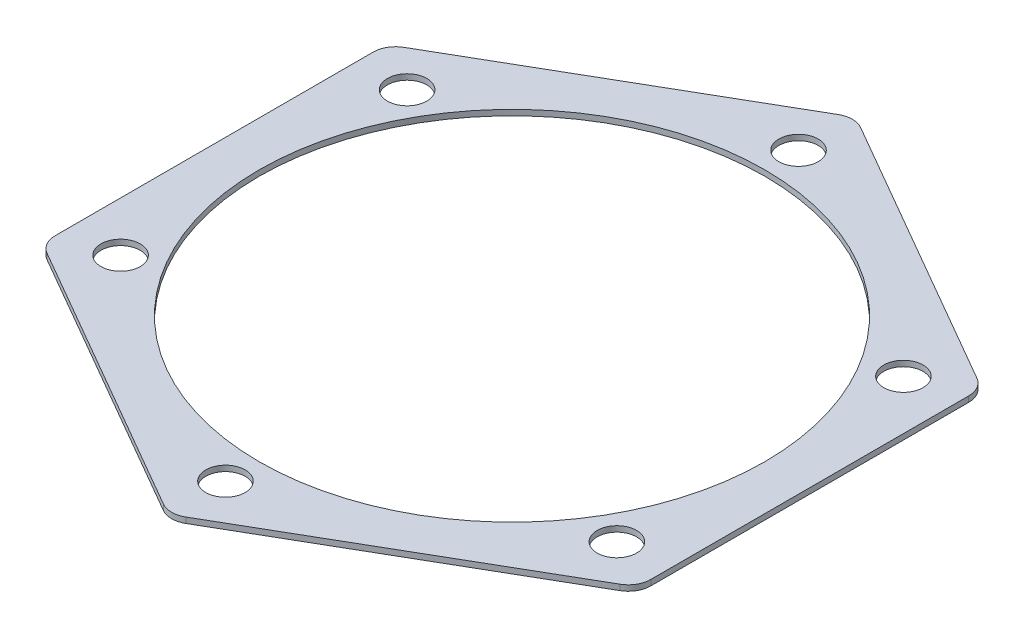
ISO-10303-21;
HEADER;
FILE_DESCRIPTION(('STEP AP214'),'2;1');
FILE_NAME('part.step','',(''),(''),'','','');
FILE_SCHEMA(('AUTOMOTIVE_DESIGN { 1 0 10303 214 1 1 1 1 }'));
ENDSEC;
DATA;
#1=APPLICATION_CONTEXT('core data for automotive mechanical design processes');
#2=APPLICATION_PROTOCOL_DEFINITION('international standard','automotive_design',2000,#1);
#3=PRODUCT_CONTEXT('',#1,'mechanical');
#4=PRODUCT('Part','Part','',(#3));
#5=PRODUCT_RELATED_PRODUCT_CATEGORY('part','',(#4));
#6=PRODUCT_DEFINITION_FORMATION('','',#4);
#7=PRODUCT_DEFINITION_CONTEXT('part definition',#1,'design');
#8=PRODUCT_DEFINITION('design','',#6,#7);
#9=PRODUCT_DEFINITION_SHAPE('','',#8);
#10=(LENGTH_UNIT() NAMED_UNIT(*) SI_UNIT(.MILLI.,.METRE.));
#11=(NAMED_UNIT(*) PLANE_ANGLE_UNIT() SI_UNIT($,.RADIAN.));
#12=(NAMED_UNIT(*) SI_UNIT($,.STERADIAN.) SOLID_ANGLE_UNIT());
#13=UNCERTAINTY_MEASURE_WITH_UNIT(LENGTH_MEASURE(1.E-05),#10,'distance_accuracy_value','');
#14=(GEOMETRIC_REPRESENTATION_CONTEXT(3) GLOBAL_UNCERTAINTY_ASSIGNED_CONTEXT((#13)) GLOBAL_UNIT_ASSIGNED_CONTEXT((#10,
#11,#12)) REPRESENTATION_CONTEXT('',''));
#15=CARTESIAN_POINT('',(0.,0.,0.));
#16=DIRECTION('',(0.,0.,1.));
#17=DIRECTION('',(1.,0.,0.));
#18=AXIS2_PLACEMENT_3D('',#15,#16,#17);
#19=CARTESIAN_POINT('',(-49.,1.,-28.2901631902917));
#20=DIRECTION('',(0.,-1.,0.));
#21=DIRECTION('',(0.,0.,-1.));
#22=AXIS2_PLACEMENT_3D('',#19,#20,#21);
#23=CYLINDRICAL_SURFACE('',#22,4.);
#24=CARTESIAN_POINT('',(-49.,0.,-28.2901631902917));
#25=DIRECTION('',(0.,1.,0.));
#26=DIRECTION('',(0.,0.,-1.));
#27=AXIS2_PLACEMENT_3D('',#24,#25,#26);
#28=CIRCLE('',#27,4.);
#29=CARTESIAN_POINT('',(-51.,0.,-31.7542648054294));
#30=VERTEX_POINT('',#29);
#31=CARTESIAN_POINT('',(-53.,0.,-28.2901631902917));
#32=VERTEX_POINT('',#31);
#33=EDGE_CURVE('E168',#30,#32,#28,.T.);
#34=ORIENTED_EDGE('',*,*,#33,.T.);
#35=DIRECTION('',(0.,-1.,0.));
#36=VECTOR('',#35,1.);
#37=CARTESIAN_POINT('',(-53.,1.,-28.2901631902917));
#38=LINE('',#37,#36);
#39=CARTESIAN_POINT('',(-53.,1.,-28.2901631902917));
#40=VERTEX_POINT('',#39);
#41=EDGE_CURVE('E11',#40,#32,#38,.T.);
#42=ORIENTED_EDGE('',*,*,#41,.F.);
#43=CARTESIAN_POINT('',(-49.,1.,-28.2901631902917));
#44=DIRECTION('',(0.,1.,0.));
#45=DIRECTION('',(0.,0.,-1.));
#46=AXIS2_PLACEMENT_3D('',#43,#44,#45);
#47=CIRCLE('',#46,4.);
#48=CARTESIAN_POINT('',(-51.,1.,-31.7542648054294));
#49=VERTEX_POINT('',#48);
#50=EDGE_CURVE('E203',#49,#40,#47,.T.);
#51=ORIENTED_EDGE('',*,*,#50,.F.);
#52=DIRECTION('',(0.,-1.,0.));
#53=VECTOR('',#52,1.);
#54=CARTESIAN_POINT('',(-51.,1.,-31.7542648054294));
#55=LINE('',#54,#53);
#56=EDGE_CURVE('E164',#49,#30,#55,.T.);
#57=ORIENTED_EDGE('',*,*,#56,.T.);
#58=EDGE_LOOP('',(#34,#42,#51,#57));
#59=FACE_BOUND('',#58,.T.);
#60=ADVANCED_FACE('F43',(#59),#23,.T.);
#61=CARTESIAN_POINT('',(-53.,1.,-28.2901631902917));
#62=DIRECTION('',(1.,0.,0.));
#63=DIRECTION('',(0.,0.,-1.));
#64=AXIS2_PLACEMENT_3D('',#61,#62,#63);
#65=PLANE('',#64);
#66=DIRECTION('',(0.,0.,1.));
#67=VECTOR('',#66,1.);
#68=CARTESIAN_POINT('',(-53.,0.,-28.2901631902917));
#69=LINE('',#68,#67);
#70=CARTESIAN_POINT('',(-53.,0.,28.2901631902916));
#71=VERTEX_POINT('',#70);
#72=EDGE_CURVE('E172',#32,#71,#69,.T.);
#73=ORIENTED_EDGE('',*,*,#72,.T.);
#74=DIRECTION('',(0.,-1.,0.));
#75=VECTOR('',#74,1.);
#76=CARTESIAN_POINT('',(-53.,1.,28.2901631902916));
#77=LINE('',#76,#75);
#78=CARTESIAN_POINT('',(-53.,1.,28.2901631902916));
#79=VERTEX_POINT('',#78);
#80=EDGE_CURVE('E52',#79,#71,#77,.T.);
#81=ORIENTED_EDGE('',*,*,#80,.F.);
#82=DIRECTION('',(0.,0.,1.));
#83=VECTOR('',#82,1.);
#84=CARTESIAN_POINT('',(-53.,1.,-28.2901631902917));
#85=LINE('',#84,#83);
#86=EDGE_CURVE('E115',#40,#79,#85,.T.);
#87=ORIENTED_EDGE('',*,*,#86,.F.);
#88=ORIENTED_EDGE('',*,*,#41,.T.);
#89=EDGE_LOOP('',(#73,#81,#87,#88));
#90=FACE_BOUND('',#89,.T.);
#91=ADVANCED_FACE('F298',(#90),#65,.F.);
#92=CARTESIAN_POINT('',(-49.,1.,28.2901631902917));
#93=DIRECTION('',(0.,-1.,0.));
#94=DIRECTION('',(0.,0.,-1.));
#95=AXIS2_PLACEMENT_3D('',#92,#93,#94);
#96=CYLINDRICAL_SURFACE('',#95,4.);
#97=CARTESIAN_POINT('',(-49.,0.,28.2901631902917));
#98=DIRECTION('',(0.,1.,0.));
#99=DIRECTION('',(0.,0.,1.));
#100=AXIS2_PLACEMENT_3D('',#97,#98,#99);
#101=CIRCLE('',#100,4.);
#102=CARTESIAN_POINT('',(-51.,0.,31.7542648054294));
#103=VERTEX_POINT('',#102);
#104=EDGE_CURVE('E176',#71,#103,#101,.T.);
#105=ORIENTED_EDGE('',*,*,#104,.T.);
#106=DIRECTION('',(0.,-1.,0.));
#107=VECTOR('',#106,1.);
#108=CARTESIAN_POINT('',(-51.,1.,31.7542648054294));
#109=LINE('',#108,#107);
#110=CARTESIAN_POINT('',(-51.,1.,31.7542648054294));
#111=VERTEX_POINT('',#110);
#112=EDGE_CURVE('E230',#111,#103,#109,.T.);
#113=ORIENTED_EDGE('',*,*,#112,.F.);
#114=CARTESIAN_POINT('',(-49.,1.,28.2901631902917));
#115=DIRECTION('',(0.,1.,0.));
#116=DIRECTION('',(0.,0.,1.));
#117=AXIS2_PLACEMENT_3D('',#114,#115,#116);
#118=CIRCLE('',#117,4.);
#119=EDGE_CURVE('E240',#79,#111,#118,.T.);
#120=ORIENTED_EDGE('',*,*,#119,.F.);
#121=ORIENTED_EDGE('',*,*,#80,.T.);
#122=EDGE_LOOP('',(#105,#113,#120,#121));
#123=FACE_BOUND('',#122,.T.);
#124=ADVANCED_FACE('F238',(#123),#96,.T.);
#125=CARTESIAN_POINT('',(-51.,1.,31.7542648054294));
#126=DIRECTION('',(0.5,0.,-0.866025403784438));
#127=DIRECTION('',(-0.866025403784438,0.,-0.5));
#128=AXIS2_PLACEMENT_3D('',#125,#126,#127);
#129=PLANE('',#128);
#130=DIRECTION('',(0.866025403784438,0.,0.5));
#131=VECTOR('',#130,1.);
#132=CARTESIAN_POINT('',(-51.,0.,31.7542648054294));
#133=LINE('',#132,#131);
#134=CARTESIAN_POINT('',(-2.00000000000004,0.,60.0444279957211));
#135=VERTEX_POINT('',#134);
#136=EDGE_CURVE('E179',#103,#135,#133,.T.);
#137=ORIENTED_EDGE('',*,*,#136,.T.);
#138=DIRECTION('',(0.,-1.,0.));
#139=VECTOR('',#138,1.);
#140=CARTESIAN_POINT('',(-2.00000000000004,1.,60.0444279957211));
#141=LINE('',#140,#139);
#142=CARTESIAN_POINT('',(-2.00000000000004,1.,60.0444279957211));
#143=VERTEX_POINT('',#142);
#144=EDGE_CURVE('E226',#143,#135,#141,.T.);
#145=ORIENTED_EDGE('',*,*,#144,.F.);
#146=DIRECTION('',(0.866025403784438,0.,0.5));
#147=VECTOR('',#146,1.);
#148=CARTESIAN_POINT('',(-51.,1.,31.7542648054294));
#149=LINE('',#148,#147);
#150=EDGE_CURVE('E259',#111,#143,#149,.T.);
#151=ORIENTED_EDGE('',*,*,#150,.F.);
#152=ORIENTED_EDGE('',*,*,#112,.T.);
#153=EDGE_LOOP('',(#137,#145,#151,#152));
#154=FACE_BOUND('',#153,.T.);
#155=ADVANCED_FACE('F249',(#154),#129,.F.);
#156=CARTESIAN_POINT('',(0.,1.,56.5803263805833));
#157=DIRECTION('',(0.,-1.,0.));
#158=DIRECTION('',(0.,0.,-1.));
#159=AXIS2_PLACEMENT_3D('',#156,#157,#158);
#160=CYLINDRICAL_SURFACE('',#159,4.00000000000001);
#161=CARTESIAN_POINT('',(0.,0.,56.5803263805833));
#162=DIRECTION('',(0.,1.,0.));
#163=DIRECTION('',(0.,0.,-1.));
#164=AXIS2_PLACEMENT_3D('',#161,#162,#163);
#165=CIRCLE('',#164,4.00000000000001);
#166=CARTESIAN_POINT('',(1.99999999999999,0.,60.0444279957211));
#167=VERTEX_POINT('',#166);
#168=EDGE_CURVE('E182',#135,#167,#165,.T.);
#169=ORIENTED_EDGE('',*,*,#168,.T.);
#170=DIRECTION('',(0.,-1.,0.));
#171=VECTOR('',#170,1.);
#172=CARTESIAN_POINT('',(1.99999999999999,1.,60.0444279957211));
#173=LINE('',#172,#171);
#174=CARTESIAN_POINT('',(1.99999999999999,1.,60.0444279957211));
#175=VERTEX_POINT('',#174);
#176=EDGE_CURVE('E222',#175,#167,#173,.T.);
#177=ORIENTED_EDGE('',*,*,#176,.F.);
#178=CARTESIAN_POINT('',(0.,1.,56.5803263805833));
#179=DIRECTION('',(0.,1.,0.));
#180=DIRECTION('',(0.,0.,-1.));
#181=AXIS2_PLACEMENT_3D('',#178,#179,#180);
#182=CIRCLE('',#181,4.00000000000001);
#183=EDGE_CURVE('E255',#143,#175,#182,.T.);
#184=ORIENTED_EDGE('',*,*,#183,.F.);
#185=ORIENTED_EDGE('',*,*,#144,.T.);
#186=EDGE_LOOP('',(#169,#177,#184,#185));
#187=FACE_BOUND('',#186,.T.);
#188=ADVANCED_FACE('F253',(#187),#160,.T.);
#189=CARTESIAN_POINT('',(1.99999999999999,1.,60.0444279957211));
#190=DIRECTION('',(-0.5,0.,-0.866025403784438));
#191=DIRECTION('',(-0.866025403784439,0.,0.5));
#192=AXIS2_PLACEMENT_3D('',#189,#190,#191);
#193=PLANE('',#192);
#194=DIRECTION('',(0.866025403784438,0.,-0.5));
#195=VECTOR('',#194,1.);
#196=CARTESIAN_POINT('',(1.99999999999999,0.,60.0444279957211));
#197=LINE('',#196,#195);
#198=CARTESIAN_POINT('',(51.,0.,31.7542648054294));
#199=VERTEX_POINT('',#198);
#200=EDGE_CURVE('E185',#167,#199,#197,.T.);
#201=ORIENTED_EDGE('',*,*,#200,.T.);
#202=DIRECTION('',(0.,-1.,0.));
#203=VECTOR('',#202,1.);
#204=CARTESIAN_POINT('',(51.,1.,31.7542648054294));
#205=LINE('',#204,#203);
#206=CARTESIAN_POINT('',(51.,1.,31.7542648054294));
#207=VERTEX_POINT('',#206);
#208=EDGE_CURVE('E218',#207,#199,#205,.T.);
#209=ORIENTED_EDGE('',*,*,#208,.F.);
#210=DIRECTION('',(0.866025403784438,0.,-0.5));
#211=VECTOR('',#210,1.);
#212=CARTESIAN_POINT('',(1.99999999999999,1.,60.0444279957211));
#213=LINE('',#212,#211);
#214=EDGE_CURVE('E258',#175,#207,#213,.T.);
#215=ORIENTED_EDGE('',*,*,#214,.F.);
#216=ORIENTED_EDGE('',*,*,#176,.T.);
#217=EDGE_LOOP('',(#201,#209,#215,#216));
#218=FACE_BOUND('',#217,.T.);
#219=ADVANCED_FACE('F311',(#218),#193,.F.);
#220=CARTESIAN_POINT('',(49.,1.,28.2901631902917));
#221=DIRECTION('',(0.,-1.,0.));
#222=DIRECTION('',(0.,0.,-1.));
#223=AXIS2_PLACEMENT_3D('',#220,#221,#222);
#224=CYLINDRICAL_SURFACE('',#223,4.);
#225=CARTESIAN_POINT('',(49.,0.,28.2901631902917));
#226=DIRECTION('',(0.,1.,0.));
#227=DIRECTION('',(0.,0.,1.));
#228=AXIS2_PLACEMENT_3D('',#225,#226,#227);
#229=CIRCLE('',#228,4.);
#230=CARTESIAN_POINT('',(53.,0.,28.2901631902916));
#231=VERTEX_POINT('',#230);
#232=EDGE_CURVE('E188',#199,#231,#229,.T.);
#233=ORIENTED_EDGE('',*,*,#232,.T.);
#234=DIRECTION('',(0.,-1.,0.));
#235=VECTOR('',#234,1.);
#236=CARTESIAN_POINT('',(53.,1.,28.2901631902916));
#237=LINE('',#236,#235);
#238=CARTESIAN_POINT('',(53.,1.,28.2901631902916));
#239=VERTEX_POINT('',#238);
#240=EDGE_CURVE('E214',#239,#231,#237,.T.);
#241=ORIENTED_EDGE('',*,*,#240,.F.);
#242=CARTESIAN_POINT('',(49.,1.,28.2901631902917));
#243=DIRECTION('',(0.,1.,0.));
#244=DIRECTION('',(0.,0.,1.));
#245=AXIS2_PLACEMENT_3D('',#242,#243,#244);
#246=CIRCLE('',#245,4.);
#247=EDGE_CURVE('E263',#207,#239,#246,.T.);
#248=ORIENTED_EDGE('',*,*,#247,.F.);
#249=ORIENTED_EDGE('',*,*,#208,.T.);
#250=EDGE_LOOP('',(#233,#241,#248,#249));
#251=FACE_BOUND('',#250,.T.);
#252=ADVANCED_FACE('F314',(#251),#224,.T.);
#253=CARTESIAN_POINT('',(53.,1.,28.2901631902916));
#254=DIRECTION('',(-1.,0.,0.));
#255=DIRECTION('',(0.,0.,1.));
#256=AXIS2_PLACEMENT_3D('',#253,#254,#255);
#257=PLANE('',#256);
#258=DIRECTION('',(0.,0.,-1.));
#259=VECTOR('',#258,1.);
#260=CARTESIAN_POINT('',(53.,0.,28.2901631902916));
#261=LINE('',#260,#259);
#262=CARTESIAN_POINT('',(53.,0.,-28.2901631902916));
#263=VERTEX_POINT('',#262);
#264=EDGE_CURVE('E191',#231,#263,#261,.T.);
#265=ORIENTED_EDGE('',*,*,#264,.T.);
#266=DIRECTION('',(0.,-1.,0.));
#267=VECTOR('',#266,1.);
#268=CARTESIAN_POINT('',(53.,1.,-28.2901631902916));
#269=LINE('',#268,#267);
#270=CARTESIAN_POINT('',(53.,1.,-28.2901631902916));
#271=VERTEX_POINT('',#270);
#272=EDGE_CURVE('E210',#271,#263,#269,.T.);
#273=ORIENTED_EDGE('',*,*,#272,.F.);
#274=DIRECTION('',(0.,0.,-1.));
#275=VECTOR('',#274,1.);
#276=CARTESIAN_POINT('',(53.,1.,28.2901631902916));
#277=LINE('',#276,#275);
#278=EDGE_CURVE('E270',#239,#271,#277,.T.);
#279=ORIENTED_EDGE('',*,*,#278,.F.);
#280=ORIENTED_EDGE('',*,*,#240,.T.);
#281=EDGE_LOOP('',(#265,#273,#279,#280));
#282=FACE_BOUND('',#281,.T.);
#283=ADVANCED_FACE('F278',(#282),#257,.F.);
#284=CARTESIAN_POINT('',(49.,1.,-28.2901631902917));
#285=DIRECTION('',(0.,-1.,0.));
#286=DIRECTION('',(0.,0.,-1.));
#287=AXIS2_PLACEMENT_3D('',#284,#285,#286);
#288=CYLINDRICAL_SURFACE('',#287,4.);
#289=CARTESIAN_POINT('',(49.,0.,-28.2901631902917));
#290=DIRECTION('',(0.,1.,0.));
#291=DIRECTION('',(0.,0.,1.));
#292=AXIS2_PLACEMENT_3D('',#289,#290,#291);
#293=CIRCLE('',#292,4.);
#294=CARTESIAN_POINT('',(51.,0.,-31.7542648054294));
#295=VERTEX_POINT('',#294);
#296=EDGE_CURVE('E194',#263,#295,#293,.T.);
#297=ORIENTED_EDGE('',*,*,#296,.T.);
#298=DIRECTION('',(0.,-1.,0.));
#299=VECTOR('',#298,1.);
#300=CARTESIAN_POINT('',(51.,1.,-31.7542648054294));
#301=LINE('',#300,#299);
#302=CARTESIAN_POINT('',(51.,1.,-31.7542648054294));
#303=VERTEX_POINT('',#302);
#304=EDGE_CURVE('E157',#303,#295,#301,.T.);
#305=ORIENTED_EDGE('',*,*,#304,.F.);
#306=CARTESIAN_POINT('',(49.,1.,-28.2901631902917));
#307=DIRECTION('',(0.,1.,0.));
#308=DIRECTION('',(0.,0.,1.));
#309=AXIS2_PLACEMENT_3D('',#306,#307,#308);
#310=CIRCLE('',#309,4.);
#311=EDGE_CURVE('E146',#271,#303,#310,.T.);
#312=ORIENTED_EDGE('',*,*,#311,.F.);
#313=ORIENTED_EDGE('',*,*,#272,.T.);
#314=EDGE_LOOP('',(#297,#305,#312,#313));
#315=FACE_BOUND('',#314,.T.);
#316=ADVANCED_FACE('F282',(#315),#288,.T.);
#317=CARTESIAN_POINT('',(51.,1.,-31.7542648054294));
#318=DIRECTION('',(-0.5,0.,0.866025403784439));
#319=DIRECTION('',(0.866025403784439,0.,0.5));
#320=AXIS2_PLACEMENT_3D('',#317,#318,#319);
#321=PLANE('',#320);
#322=DIRECTION('',(-0.866025403784439,0.,-0.5));
#323=VECTOR('',#322,1.);
#324=CARTESIAN_POINT('',(51.,0.,-31.7542648054294));
#325=LINE('',#324,#323);
#326=CARTESIAN_POINT('',(2.00000000000002,0.,-60.0444279957211));
#327=VERTEX_POINT('',#326);
#328=EDGE_CURVE('E155',#295,#327,#325,.T.);
#329=ORIENTED_EDGE('',*,*,#328,.T.);
#330=DIRECTION('',(0.,-1.,0.));
#331=VECTOR('',#330,1.);
#332=CARTESIAN_POINT('',(2.00000000000002,1.,-60.0444279957211));
#333=LINE('',#332,#331);
#334=CARTESIAN_POINT('',(2.00000000000002,1.,-60.0444279957211));
#335=VERTEX_POINT('',#334);
#336=EDGE_CURVE('E152',#335,#327,#333,.T.);
#337=ORIENTED_EDGE('',*,*,#336,.F.);
#338=DIRECTION('',(-0.866025403784439,0.,-0.5));
#339=VECTOR('',#338,1.);
#340=CARTESIAN_POINT('',(51.,1.,-31.7542648054294));
#341=LINE('',#340,#339);
#342=EDGE_CURVE('E140',#303,#335,#341,.T.);
#343=ORIENTED_EDGE('',*,*,#342,.F.);
#344=ORIENTED_EDGE('',*,*,#304,.T.);
#345=EDGE_LOOP('',(#329,#337,#343,#344));
#346=FACE_BOUND('',#345,.T.);
#347=ADVANCED_FACE('F153',(#346),#321,.F.);
#348=CARTESIAN_POINT('',(0.,1.,-56.5803263805833));
#349=DIRECTION('',(0.,-1.,0.));
#350=DIRECTION('',(0.,0.,-1.));
#351=AXIS2_PLACEMENT_3D('',#348,#349,#350);
#352=CYLINDRICAL_SURFACE('',#351,4.00000000000001);
#353=CARTESIAN_POINT('',(0.,0.,-56.5803263805833));
#354=DIRECTION('',(0.,1.,0.));
#355=DIRECTION('',(0.,0.,1.));
#356=AXIS2_PLACEMENT_3D('',#353,#354,#355);
#357=CIRCLE('',#356,4.00000000000001);
#358=CARTESIAN_POINT('',(-2.00000000000002,0.,-60.0444279957211));
#359=VERTEX_POINT('',#358);
#360=EDGE_CURVE('E101',#327,#359,#357,.T.);
#361=ORIENTED_EDGE('',*,*,#360,.T.);
#362=DIRECTION('',(0.,-1.,0.));
#363=VECTOR('',#362,1.);
#364=CARTESIAN_POINT('',(-2.00000000000002,1.,-60.0444279957211));
#365=LINE('',#364,#363);
#366=CARTESIAN_POINT('',(-2.00000000000002,1.,-60.0444279957211));
#367=VERTEX_POINT('',#366);
#368=EDGE_CURVE('E158',#367,#359,#365,.T.);
#369=ORIENTED_EDGE('',*,*,#368,.F.);
#370=CARTESIAN_POINT('',(0.,1.,-56.5803263805833));
#371=DIRECTION('',(0.,1.,0.));
#372=DIRECTION('',(0.,0.,1.));
#373=AXIS2_PLACEMENT_3D('',#370,#371,#372);
#374=CIRCLE('',#373,4.00000000000001);
#375=EDGE_CURVE('E144',#335,#367,#374,.T.);
#376=ORIENTED_EDGE('',*,*,#375,.F.);
#377=ORIENTED_EDGE('',*,*,#336,.T.);
#378=EDGE_LOOP('',(#361,#369,#376,#377));
#379=FACE_BOUND('',#378,.T.);
#380=ADVANCED_FACE('F160',(#379),#352,.T.);
#381=CARTESIAN_POINT('',(-2.00000000000002,1.,-60.0444279957211));
#382=DIRECTION('',(0.5,0.,0.866025403784439));
#383=DIRECTION('',(0.866025403784439,0.,-0.5));
#384=AXIS2_PLACEMENT_3D('',#381,#382,#383);
#385=PLANE('',#384);
#386=DIRECTION('',(-0.866025403784439,0.,0.5));
#387=VECTOR('',#386,1.);
#388=CARTESIAN_POINT('',(-2.00000000000002,0.,-60.0444279957211));
#389=LINE('',#388,#387);
#390=EDGE_CURVE('E107',#359,#30,#389,.T.);
#391=ORIENTED_EDGE('',*,*,#390,.T.);
#392=ORIENTED_EDGE('',*,*,#56,.F.);
#393=DIRECTION('',(-0.866025403784439,0.,0.5));
#394=VECTOR('',#393,1.);
#395=CARTESIAN_POINT('',(-2.00000000000002,1.,-60.0444279957211));
#396=LINE('',#395,#394);
#397=EDGE_CURVE('E60',#367,#49,#396,.T.);
#398=ORIENTED_EDGE('',*,*,#397,.F.);
#399=ORIENTED_EDGE('',*,*,#368,.T.);
#400=EDGE_LOOP('',(#391,#392,#398,#399));
#401=FACE_BOUND('',#400,.T.);
#402=ADVANCED_FACE('F286',(#401),#385,.F.);
#403=CARTESIAN_POINT('',(-49.,1.,-28.2901631902917));
#404=DIRECTION('',(0.,-1.,0.));
#405=DIRECTION('',(0.,0.,-1.));
#406=AXIS2_PLACEMENT_3D('',#403,#404,#405);
#407=PLANE('',#406);
#408=CARTESIAN_POINT('',(0.,1.,0.));
#409=DIRECTION('',(0.,-1.,0.));
#410=DIRECTION('',(0.,0.,-1.));
#411=AXIS2_PLACEMENT_3D('',#408,#409,#410);
#412=CIRCLE('',#411,45.);
#413=CARTESIAN_POINT('',(0.,1.,-45.));
#414=VERTEX_POINT('',#413);
#415=EDGE_CURVE('E519',#414,#414,#412,.T.);
#416=ORIENTED_EDGE('',*,*,#415,.T.);
#417=EDGE_LOOP('',(#416));
#418=FACE_BOUND('',#417,.T.);
#419=CARTESIAN_POINT('',(0.,1.,-51.));
#420=DIRECTION('',(0.,1.,0.));
#421=DIRECTION('',(0.,0.,1.));
#422=AXIS2_PLACEMENT_3D('',#419,#420,#421);
#423=CIRCLE('',#422,3.5);
#424=CARTESIAN_POINT('',(0.,1.,-47.5));
#425=VERTEX_POINT('',#424);
#426=EDGE_CURVE('E532',#425,#425,#423,.T.);
#427=ORIENTED_EDGE('',*,*,#426,.F.);
#428=EDGE_LOOP('',(#427));
#429=FACE_BOUND('',#428,.T.);
#430=CARTESIAN_POINT('',(-44.1672955930042,1.,-25.4999999999962));
#431=DIRECTION('',(0.,1.,0.));
#432=DIRECTION('',(0.,0.,1.));
#433=AXIS2_PLACEMENT_3D('',#430,#431,#432);
#434=CIRCLE('',#433,3.50000000000378);
#435=CARTESIAN_POINT('',(-44.1672955930042,1.,-21.9999999999924));
#436=VERTEX_POINT('',#435);
#437=EDGE_CURVE('E537',#436,#436,#434,.T.);
#438=ORIENTED_EDGE('',*,*,#437,.F.);
#439=EDGE_LOOP('',(#438));
#440=FACE_BOUND('',#439,.T.);
#441=CARTESIAN_POINT('',(-44.1672955929999,1.,25.5000000000038));
#442=DIRECTION('',(0.,1.,0.));
#443=DIRECTION('',(0.,0.,1.));
#444=AXIS2_PLACEMENT_3D('',#441,#442,#443);
#445=CIRCLE('',#444,3.5000000000078);
#446=CARTESIAN_POINT('',(-44.1672955929999,1.,29.0000000000116));
#447=VERTEX_POINT('',#446);
#448=EDGE_CURVE('E568',#447,#447,#445,.T.);
#449=ORIENTED_EDGE('',*,*,#448,.F.);
#450=EDGE_LOOP('',(#449));
#451=FACE_BOUND('',#450,.T.);
#452=CARTESIAN_POINT('',(8.67830598967667E-12,1.,51.));
#453=DIRECTION('',(0.,1.,0.));
#454=DIRECTION('',(0.,0.,1.));
#455=AXIS2_PLACEMENT_3D('',#452,#453,#454);
#456=CIRCLE('',#455,3.50000000000864);
#457=CARTESIAN_POINT('',(8.67830598967667E-12,1.,54.5000000000086));
#458=VERTEX_POINT('',#457);
#459=EDGE_CURVE('E560',#458,#458,#456,.T.);
#460=ORIENTED_EDGE('',*,*,#459,.F.);
#461=EDGE_LOOP('',(#460));
#462=FACE_BOUND('',#461,.T.);
#463=CARTESIAN_POINT('',(44.1672955930129,1.,25.4999999999962));
#464=DIRECTION('',(0.,1.,0.));
#465=DIRECTION('',(0.,0.,1.));
#466=AXIS2_PLACEMENT_3D('',#463,#464,#465);
#467=CIRCLE('',#466,3.50000000000536);
#468=CARTESIAN_POINT('',(44.1672955930129,1.,29.0000000000016));
#469=VERTEX_POINT('',#468);
#470=EDGE_CURVE('E552',#469,#469,#467,.T.);
#471=ORIENTED_EDGE('',*,*,#470,.F.);
#472=EDGE_LOOP('',(#471));
#473=FACE_BOUND('',#472,.T.);
#474=CARTESIAN_POINT('',(44.1672955930085,1.,-25.5000000000038));
#475=DIRECTION('',(0.,1.,0.));
#476=DIRECTION('',(0.,0.,1.));
#477=AXIS2_PLACEMENT_3D('',#474,#475,#476);
#478=CIRCLE('',#477,3.50000000000111);
#479=CARTESIAN_POINT('',(44.1672955930085,1.,-22.0000000000027));
#480=VERTEX_POINT('',#479);
#481=EDGE_CURVE('E536',#480,#480,#478,.T.);
#482=ORIENTED_EDGE('',*,*,#481,.F.);
#483=EDGE_LOOP('',(#482));
#484=FACE_BOUND('',#483,.T.);
#485=ORIENTED_EDGE('',*,*,#50,.T.);
#486=ORIENTED_EDGE('',*,*,#86,.T.);
#487=ORIENTED_EDGE('',*,*,#119,.T.);
#488=ORIENTED_EDGE('',*,*,#150,.T.);
#489=ORIENTED_EDGE('',*,*,#183,.T.);
#490=ORIENTED_EDGE('',*,*,#214,.T.);
#491=ORIENTED_EDGE('',*,*,#247,.T.);
#492=ORIENTED_EDGE('',*,*,#278,.T.);
#493=ORIENTED_EDGE('',*,*,#311,.T.);
#494=ORIENTED_EDGE('',*,*,#342,.T.);
#495=ORIENTED_EDGE('',*,*,#375,.T.);
#496=ORIENTED_EDGE('',*,*,#397,.T.);
#497=EDGE_LOOP('',(#485,#486,#487,#488,#489,#490,#491,#492,#493,#494,#495,#496));
#498=FACE_BOUND('',#497,.T.);
#499=ADVANCED_FACE('F142',(#418,#429,#440,#451,#462,#473,#484,#498),#407,.F.);
#500=CARTESIAN_POINT('',(-49.,0.,-28.2901631902917));
#501=DIRECTION('',(0.,-1.,0.));
#502=DIRECTION('',(0.,0.,-1.));
#503=AXIS2_PLACEMENT_3D('',#500,#501,#502);
#504=PLANE('',#503);
#505=CARTESIAN_POINT('',(0.,0.,0.));
#506=DIRECTION('',(0.,-1.,0.));
#507=DIRECTION('',(0.,0.,-1.));
#508=AXIS2_PLACEMENT_3D('',#505,#506,#507);
#509=CIRCLE('',#508,45.);
#510=CARTESIAN_POINT('',(0.,0.,-45.));
#511=VERTEX_POINT('',#510);
#512=EDGE_CURVE('E522',#511,#511,#509,.T.);
#513=ORIENTED_EDGE('',*,*,#512,.F.);
#514=EDGE_LOOP('',(#513));
#515=FACE_BOUND('',#514,.T.);
#516=CARTESIAN_POINT('',(0.,0.,-51.));
#517=DIRECTION('',(0.,1.,0.));
#518=DIRECTION('',(0.,0.,1.));
#519=AXIS2_PLACEMENT_3D('',#516,#517,#518);
#520=CIRCLE('',#519,3.5);
#521=CARTESIAN_POINT('',(0.,0.,-47.5));
#522=VERTEX_POINT('',#521);
#523=EDGE_CURVE('E173',#522,#522,#520,.T.);
#524=ORIENTED_EDGE('',*,*,#523,.T.);
#525=EDGE_LOOP('',(#524));
#526=FACE_BOUND('',#525,.T.);
#527=CARTESIAN_POINT('',(-44.1672955930042,0.,-25.4999999999962));
#528=DIRECTION('',(0.,1.,0.));
#529=DIRECTION('',(0.,0.,1.));
#530=AXIS2_PLACEMENT_3D('',#527,#528,#529);
#531=CIRCLE('',#530,3.50000000000378);
#532=CARTESIAN_POINT('',(-44.1672955930042,0.,-21.9999999999924));
#533=VERTEX_POINT('',#532);
#534=EDGE_CURVE('E526',#533,#533,#531,.T.);
#535=ORIENTED_EDGE('',*,*,#534,.T.);
#536=EDGE_LOOP('',(#535));
#537=FACE_BOUND('',#536,.T.);
#538=CARTESIAN_POINT('',(-44.1672955929999,0.,25.5000000000038));
#539=DIRECTION('',(0.,1.,0.));
#540=DIRECTION('',(0.,0.,1.));
#541=AXIS2_PLACEMENT_3D('',#538,#539,#540);
#542=CIRCLE('',#541,3.5000000000078);
#543=CARTESIAN_POINT('',(-44.1672955929999,0.,29.0000000000116));
#544=VERTEX_POINT('',#543);
#545=EDGE_CURVE('E541',#544,#544,#542,.T.);
#546=ORIENTED_EDGE('',*,*,#545,.T.);
#547=EDGE_LOOP('',(#546));
#548=FACE_BOUND('',#547,.T.);
#549=CARTESIAN_POINT('',(8.67830598967667E-12,0.,51.));
#550=DIRECTION('',(0.,1.,0.));
#551=DIRECTION('',(0.,0.,1.));
#552=AXIS2_PLACEMENT_3D('',#549,#550,#551);
#553=CIRCLE('',#552,3.50000000000864);
#554=CARTESIAN_POINT('',(8.67830598967667E-12,0.,54.5000000000086));
#555=VERTEX_POINT('',#554);
#556=EDGE_CURVE('E564',#555,#555,#553,.T.);
#557=ORIENTED_EDGE('',*,*,#556,.T.);
#558=EDGE_LOOP('',(#557));
#559=FACE_BOUND('',#558,.T.);
#560=CARTESIAN_POINT('',(44.1672955930129,0.,25.4999999999962));
#561=DIRECTION('',(0.,1.,0.));
#562=DIRECTION('',(0.,0.,1.));
#563=AXIS2_PLACEMENT_3D('',#560,#561,#562);
#564=CIRCLE('',#563,3.50000000000536);
#565=CARTESIAN_POINT('',(44.1672955930129,0.,29.0000000000016));
#566=VERTEX_POINT('',#565);
#567=EDGE_CURVE('E556',#566,#566,#564,.T.);
#568=ORIENTED_EDGE('',*,*,#567,.T.);
#569=EDGE_LOOP('',(#568));
#570=FACE_BOUND('',#569,.T.);
#571=CARTESIAN_POINT('',(44.1672955930085,0.,-25.5000000000038));
#572=DIRECTION('',(0.,1.,0.));
#573=DIRECTION('',(0.,0.,1.));
#574=AXIS2_PLACEMENT_3D('',#571,#572,#573);
#575=CIRCLE('',#574,3.50000000000111);
#576=CARTESIAN_POINT('',(44.1672955930085,0.,-22.0000000000027));
#577=VERTEX_POINT('',#576);
#578=EDGE_CURVE('E548',#577,#577,#575,.T.);
#579=ORIENTED_EDGE('',*,*,#578,.T.);
#580=EDGE_LOOP('',(#579));
#581=FACE_BOUND('',#580,.T.);
#582=ORIENTED_EDGE('',*,*,#33,.F.);
#583=ORIENTED_EDGE('',*,*,#390,.F.);
#584=ORIENTED_EDGE('',*,*,#360,.F.);
#585=ORIENTED_EDGE('',*,*,#328,.F.);
#586=ORIENTED_EDGE('',*,*,#296,.F.);
#587=ORIENTED_EDGE('',*,*,#264,.F.);
#588=ORIENTED_EDGE('',*,*,#232,.F.);
#589=ORIENTED_EDGE('',*,*,#200,.F.);
#590=ORIENTED_EDGE('',*,*,#168,.F.);
#591=ORIENTED_EDGE('',*,*,#136,.F.);
#592=ORIENTED_EDGE('',*,*,#104,.F.);
#593=ORIENTED_EDGE('',*,*,#72,.F.);
#594=EDGE_LOOP('',(#582,#583,#584,#585,#586,#587,#588,#589,#590,#591,#592,#593));
#595=FACE_BOUND('',#594,.T.);
#596=ADVANCED_FACE('F244',(#515,#526,#537,#548,#559,#570,#581,#595),#504,.T.);
#597=CARTESIAN_POINT('',(44.1672955930085,0.,-25.5000000000038));
#598=DIRECTION('',(0.,1.,0.));
#599=DIRECTION('',(0.,0.,1.));
#600=AXIS2_PLACEMENT_3D('',#597,#598,#599);
#601=CYLINDRICAL_SURFACE('',#600,3.50000000000111);
#602=ORIENTED_EDGE('',*,*,#578,.F.);
#603=EDGE_LOOP('',(#602));
#604=FACE_BOUND('',#603,.T.);
#605=ORIENTED_EDGE('',*,*,#481,.T.);
#606=EDGE_LOOP('',(#605));
#607=FACE_BOUND('',#606,.T.);
#608=ADVANCED_FACE('F344',(#604,#607),#601,.F.);
#609=CARTESIAN_POINT('',(44.1672955930129,0.,25.4999999999962));
#610=DIRECTION('',(0.,1.,0.));
#611=DIRECTION('',(0.,0.,1.));
#612=AXIS2_PLACEMENT_3D('',#609,#610,#611);
#613=CYLINDRICAL_SURFACE('',#612,3.50000000000536);
#614=ORIENTED_EDGE('',*,*,#567,.F.);
#615=EDGE_LOOP('',(#614));
#616=FACE_BOUND('',#615,.T.);
#617=ORIENTED_EDGE('',*,*,#470,.T.);
#618=EDGE_LOOP('',(#617));
#619=FACE_BOUND('',#618,.T.);
#620=ADVANCED_FACE('F349',(#616,#619),#613,.F.);
#621=CARTESIAN_POINT('',(8.67830598967667E-12,0.,51.));
#622=DIRECTION('',(0.,1.,0.));
#623=DIRECTION('',(0.,0.,1.));
#624=AXIS2_PLACEMENT_3D('',#621,#622,#623);
#625=CYLINDRICAL_SURFACE('',#624,3.50000000000864);
#626=ORIENTED_EDGE('',*,*,#556,.F.);
#627=EDGE_LOOP('',(#626));
#628=FACE_BOUND('',#627,.T.);
#629=ORIENTED_EDGE('',*,*,#459,.T.);
#630=EDGE_LOOP('',(#629));
#631=FACE_BOUND('',#630,.T.);
#632=ADVANCED_FACE('F362',(#628,#631),#625,.F.);
#633=CARTESIAN_POINT('',(-44.1672955929999,0.,25.5000000000038));
#634=DIRECTION('',(0.,1.,0.));
#635=DIRECTION('',(0.,0.,1.));
#636=AXIS2_PLACEMENT_3D('',#633,#634,#635);
#637=CYLINDRICAL_SURFACE('',#636,3.5000000000078);
#638=ORIENTED_EDGE('',*,*,#545,.F.);
#639=EDGE_LOOP('',(#638));
#640=FACE_BOUND('',#639,.T.);
#641=ORIENTED_EDGE('',*,*,#448,.T.);
#642=EDGE_LOOP('',(#641));
#643=FACE_BOUND('',#642,.T.);
#644=ADVANCED_FACE('F373',(#640,#643),#637,.F.);
#645=CARTESIAN_POINT('',(-44.1672955930042,0.,-25.4999999999962));
#646=DIRECTION('',(0.,1.,0.));
#647=DIRECTION('',(0.,0.,1.));
#648=AXIS2_PLACEMENT_3D('',#645,#646,#647);
#649=CYLINDRICAL_SURFACE('',#648,3.50000000000378);
#650=ORIENTED_EDGE('',*,*,#534,.F.);
#651=EDGE_LOOP('',(#650));
#652=FACE_BOUND('',#651,.T.);
#653=ORIENTED_EDGE('',*,*,#437,.T.);
#654=EDGE_LOOP('',(#653));
#655=FACE_BOUND('',#654,.T.);
#656=ADVANCED_FACE('F384',(#652,#655),#649,.F.);
#657=CARTESIAN_POINT('',(0.,0.,-51.));
#658=DIRECTION('',(0.,1.,0.));
#659=DIRECTION('',(0.,0.,1.));
#660=AXIS2_PLACEMENT_3D('',#657,#658,#659);
#661=CYLINDRICAL_SURFACE('',#660,3.5);
#662=ORIENTED_EDGE('',*,*,#523,.F.);
#663=EDGE_LOOP('',(#662));
#664=FACE_BOUND('',#663,.T.);
#665=ORIENTED_EDGE('',*,*,#426,.T.);
#666=EDGE_LOOP('',(#665));
#667=FACE_BOUND('',#666,.T.);
#668=ADVANCED_FACE('F395',(#664,#667),#661,.F.);
#669=CARTESIAN_POINT('',(0.,1.,0.));
#670=DIRECTION('',(0.,-1.,0.));
#671=DIRECTION('',(0.,0.,-1.));
#672=AXIS2_PLACEMENT_3D('',#669,#670,#671);
#673=CYLINDRICAL_SURFACE('',#672,45.);
#674=ORIENTED_EDGE('',*,*,#415,.F.);
#675=EDGE_LOOP('',(#674));
#676=FACE_BOUND('',#675,.T.);
#677=ORIENTED_EDGE('',*,*,#512,.T.);
#678=EDGE_LOOP('',(#677));
#679=FACE_BOUND('',#678,.T.);
#680=ADVANCED_FACE('F406',(#676,#679),#673,.F.);
#681=CLOSED_SHELL('',(#60,#91,#124,#155,#188,#219,#252,#283,#316,#347,#380,#402,#499,#596,#608,
#620,#632,#644,#656,#668,#680));
#682=MANIFOLD_SOLID_BREP('B2',#681);
#683=ADVANCED_BREP_SHAPE_REPRESENTATION('',(#18,#682),#14);
#684=SHAPE_DEFINITION_REPRESENTATION(#9,#683);
ENDSEC;
END-ISO-10303-21;
